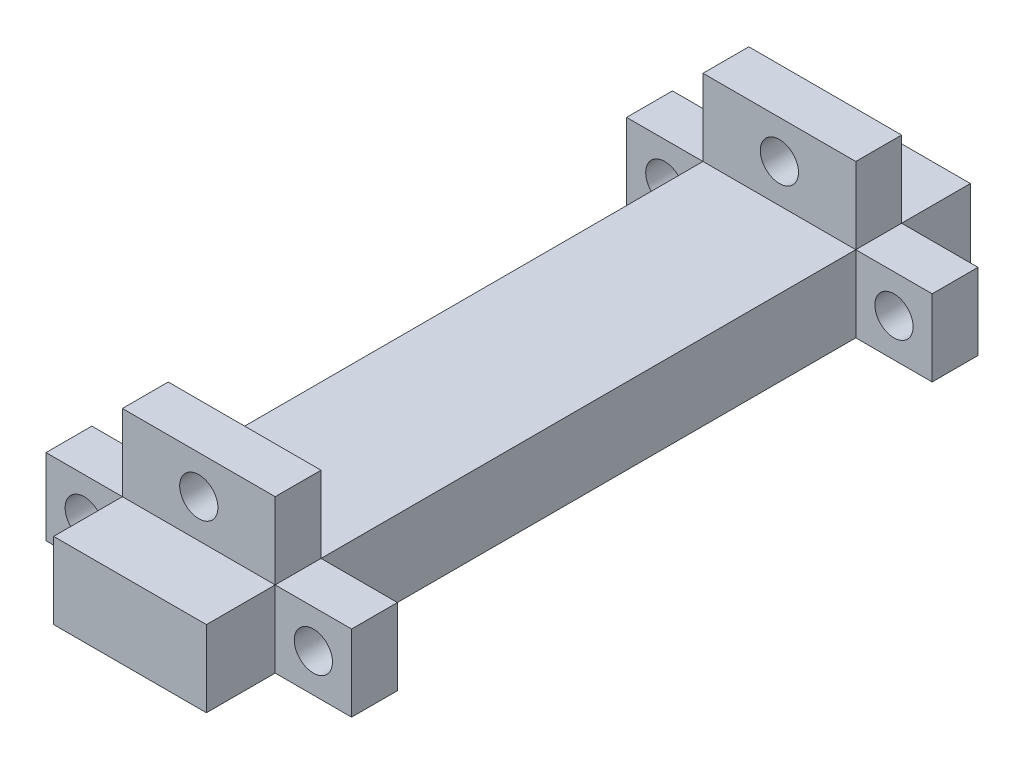
ISO-10303-21;
HEADER;
FILE_DESCRIPTION(('STEP AP214'),'2;1');
FILE_NAME('part.step','',(''),(''),'','','');
FILE_SCHEMA(('AUTOMOTIVE_DESIGN { 1 0 10303 214 1 1 1 1 }'));
ENDSEC;
DATA;
#1=APPLICATION_CONTEXT('core data for automotive mechanical design processes');
#2=APPLICATION_PROTOCOL_DEFINITION('international standard','automotive_design',2000,#1);
#3=PRODUCT_CONTEXT('',#1,'mechanical');
#4=PRODUCT('Part','Part','',(#3));
#5=PRODUCT_RELATED_PRODUCT_CATEGORY('part','',(#4));
#6=PRODUCT_DEFINITION_FORMATION('','',#4);
#7=PRODUCT_DEFINITION_CONTEXT('part definition',#1,'design');
#8=PRODUCT_DEFINITION('design','',#6,#7);
#9=PRODUCT_DEFINITION_SHAPE('','',#8);
#10=(LENGTH_UNIT() NAMED_UNIT(*) SI_UNIT(.MILLI.,.METRE.));
#11=(NAMED_UNIT(*) PLANE_ANGLE_UNIT() SI_UNIT($,.RADIAN.));
#12=(NAMED_UNIT(*) SI_UNIT($,.STERADIAN.) SOLID_ANGLE_UNIT());
#13=UNCERTAINTY_MEASURE_WITH_UNIT(LENGTH_MEASURE(1.E-05),#10,'distance_accuracy_value','');
#14=(GEOMETRIC_REPRESENTATION_CONTEXT(3) GLOBAL_UNCERTAINTY_ASSIGNED_CONTEXT((#13)) GLOBAL_UNIT_ASSIGNED_CONTEXT((#10,
#11,#12)) REPRESENTATION_CONTEXT('',''));
#15=CARTESIAN_POINT('',(0.,0.,0.));
#16=DIRECTION('',(0.,0.,1.));
#17=DIRECTION('',(1.,0.,0.));
#18=AXIS2_PLACEMENT_3D('',#15,#16,#17);
#19=CARTESIAN_POINT('',(0.,0.,100.));
#20=DIRECTION('',(-1.,0.,0.));
#21=DIRECTION('',(0.,-1.,0.));
#22=AXIS2_PLACEMENT_3D('',#19,#20,#21);
#23=PLANE('',#22);
#24=DIRECTION('',(0.,0.,-1.));
#25=VECTOR('',#24,1.);
#26=CARTESIAN_POINT('',(0.,0.,100.));
#27=LINE('',#26,#25);
#28=CARTESIAN_POINT('',(0.,0.,85.));
#29=VERTEX_POINT('',#28);
#30=CARTESIAN_POINT('',(0.,0.,15.));
#31=VERTEX_POINT('',#30);
#32=EDGE_CURVE('E54',#29,#31,#27,.T.);
#33=ORIENTED_EDGE('',*,*,#32,.F.);
#34=DIRECTION('',(0.,1.,0.));
#35=VECTOR('',#34,1.);
#36=CARTESIAN_POINT('',(0.,0.,85.));
#37=LINE('',#36,#35);
#38=CARTESIAN_POINT('',(0.,10.,85.));
#39=VERTEX_POINT('',#38);
#40=EDGE_CURVE('E211',#29,#39,#37,.T.);
#41=ORIENTED_EDGE('',*,*,#40,.T.);
#42=DIRECTION('',(0.,0.,-1.));
#43=VECTOR('',#42,1.);
#44=CARTESIAN_POINT('',(0.,10.,100.));
#45=LINE('',#44,#43);
#46=CARTESIAN_POINT('',(0.,10.,15.));
#47=VERTEX_POINT('',#46);
#48=EDGE_CURVE('E406',#39,#47,#45,.T.);
#49=ORIENTED_EDGE('',*,*,#48,.T.);
#50=DIRECTION('',(0.,1.,0.));
#51=VECTOR('',#50,1.);
#52=CARTESIAN_POINT('',(0.,0.,15.));
#53=LINE('',#52,#51);
#54=EDGE_CURVE('E328',#31,#47,#53,.T.);
#55=ORIENTED_EDGE('',*,*,#54,.F.);
#56=EDGE_LOOP('',(#33,#41,#49,#55));
#57=FACE_BOUND('',#56,.T.);
#58=ADVANCED_FACE('F36',(#57),#23,.T.);
#59=DIRECTION('',(0.,0.,1.));
#60=VECTOR('',#59,1.);
#61=CARTESIAN_POINT('',(0.,10.,85.));
#62=LINE('',#61,#60);
#63=CARTESIAN_POINT('',(0.,10.,91.));
#64=VERTEX_POINT('',#63);
#65=EDGE_CURVE('E234',#39,#64,#62,.T.);
#66=ORIENTED_EDGE('',*,*,#65,.T.);
#67=DIRECTION('',(0.,1.,0.));
#68=VECTOR('',#67,1.);
#69=CARTESIAN_POINT('',(0.,0.,91.));
#70=LINE('',#69,#68);
#71=CARTESIAN_POINT('',(0.,20.,91.));
#72=VERTEX_POINT('',#71);
#73=EDGE_CURVE('E240',#64,#72,#70,.T.);
#74=ORIENTED_EDGE('',*,*,#73,.T.);
#75=DIRECTION('',(0.,0.,1.));
#76=VECTOR('',#75,1.);
#77=CARTESIAN_POINT('',(0.,20.,85.));
#78=LINE('',#77,#76);
#79=CARTESIAN_POINT('',(0.,20.,85.));
#80=VERTEX_POINT('',#79);
#81=EDGE_CURVE('E245',#80,#72,#78,.T.);
#82=ORIENTED_EDGE('',*,*,#81,.F.);
#83=DIRECTION('',(0.,1.,0.));
#84=VECTOR('',#83,1.);
#85=CARTESIAN_POINT('',(0.,0.,85.));
#86=LINE('',#85,#84);
#87=EDGE_CURVE('E243',#39,#80,#86,.T.);
#88=ORIENTED_EDGE('',*,*,#87,.F.);
#89=EDGE_LOOP('',(#66,#74,#82,#88));
#90=FACE_BOUND('',#89,.T.);
#91=ADVANCED_FACE('F466',(#90),#23,.T.);
#92=CARTESIAN_POINT('',(0.,10.,100.));
#93=DIRECTION('',(0.,1.,0.));
#94=DIRECTION('',(0.,0.,1.));
#95=AXIS2_PLACEMENT_3D('',#92,#93,#94);
#96=PLANE('',#95);
#97=ORIENTED_EDGE('',*,*,#48,.F.);
#98=DIRECTION('',(1.,0.,0.));
#99=VECTOR('',#98,1.);
#100=CARTESIAN_POINT('',(0.,10.,85.));
#101=LINE('',#100,#99);
#102=CARTESIAN_POINT('',(20.,10.,85.));
#103=VERTEX_POINT('',#102);
#104=EDGE_CURVE('E226',#39,#103,#101,.T.);
#105=ORIENTED_EDGE('',*,*,#104,.T.);
#106=DIRECTION('',(0.,0.,-1.));
#107=VECTOR('',#106,1.);
#108=CARTESIAN_POINT('',(20.,10.,100.));
#109=LINE('',#108,#107);
#110=CARTESIAN_POINT('',(20.,10.,15.));
#111=VERTEX_POINT('',#110);
#112=EDGE_CURVE('E409',#103,#111,#109,.T.);
#113=ORIENTED_EDGE('',*,*,#112,.T.);
#114=DIRECTION('',(1.,0.,0.));
#115=VECTOR('',#114,1.);
#116=CARTESIAN_POINT('',(0.,10.,15.));
#117=LINE('',#116,#115);
#118=EDGE_CURVE('E351',#47,#111,#117,.T.);
#119=ORIENTED_EDGE('',*,*,#118,.F.);
#120=EDGE_LOOP('',(#97,#105,#113,#119));
#121=FACE_BOUND('',#120,.T.);
#122=ADVANCED_FACE('F530',(#121),#96,.T.);
#123=DIRECTION('',(0.,0.,1.));
#124=VECTOR('',#123,1.);
#125=CARTESIAN_POINT('',(20.,10.,85.));
#126=LINE('',#125,#124);
#127=CARTESIAN_POINT('',(20.,10.,91.));
#128=VERTEX_POINT('',#127);
#129=EDGE_CURVE('E237',#103,#128,#126,.T.);
#130=ORIENTED_EDGE('',*,*,#129,.T.);
#131=DIRECTION('',(1.,0.,0.));
#132=VECTOR('',#131,1.);
#133=CARTESIAN_POINT('',(0.,10.,91.));
#134=LINE('',#133,#132);
#135=CARTESIAN_POINT('',(30.,10.,91.));
#136=VERTEX_POINT('',#135);
#137=EDGE_CURVE('E282',#128,#136,#134,.T.);
#138=ORIENTED_EDGE('',*,*,#137,.T.);
#139=DIRECTION('',(0.,0.,1.));
#140=VECTOR('',#139,1.);
#141=CARTESIAN_POINT('',(30.,10.,85.));
#142=LINE('',#141,#140);
#143=CARTESIAN_POINT('',(30.,10.,85.));
#144=VERTEX_POINT('',#143);
#145=EDGE_CURVE('E279',#144,#136,#142,.T.);
#146=ORIENTED_EDGE('',*,*,#145,.F.);
#147=DIRECTION('',(1.,0.,0.));
#148=VECTOR('',#147,1.);
#149=CARTESIAN_POINT('',(0.,10.,85.));
#150=LINE('',#149,#148);
#151=EDGE_CURVE('E270',#103,#144,#150,.T.);
#152=ORIENTED_EDGE('',*,*,#151,.F.);
#153=EDGE_LOOP('',(#130,#138,#146,#152));
#154=FACE_BOUND('',#153,.T.);
#155=ADVANCED_FACE('F545',(#154),#96,.T.);
#156=CARTESIAN_POINT('',(20.,0.,100.));
#157=DIRECTION('',(-1.,0.,0.));
#158=DIRECTION('',(0.,-1.,0.));
#159=AXIS2_PLACEMENT_3D('',#156,#157,#158);
#160=PLANE('',#159);
#161=DIRECTION('',(0.,-1.,0.));
#162=VECTOR('',#161,1.);
#163=CARTESIAN_POINT('',(20.,0.,85.));
#164=LINE('',#163,#162);
#165=CARTESIAN_POINT('',(20.,0.,85.));
#166=VERTEX_POINT('',#165);
#167=EDGE_CURVE('E273',#103,#166,#164,.T.);
#168=ORIENTED_EDGE('',*,*,#167,.T.);
#169=DIRECTION('',(0.,0.,-1.));
#170=VECTOR('',#169,1.);
#171=CARTESIAN_POINT('',(20.,0.,100.));
#172=LINE('',#171,#170);
#173=CARTESIAN_POINT('',(20.,0.,15.));
#174=VERTEX_POINT('',#173);
#175=EDGE_CURVE('E45',#166,#174,#172,.T.);
#176=ORIENTED_EDGE('',*,*,#175,.T.);
#177=DIRECTION('',(0.,-1.,0.));
#178=VECTOR('',#177,1.);
#179=CARTESIAN_POINT('',(20.,0.,15.));
#180=LINE('',#179,#178);
#181=EDGE_CURVE('E300',#111,#174,#180,.T.);
#182=ORIENTED_EDGE('',*,*,#181,.F.);
#183=ORIENTED_EDGE('',*,*,#112,.F.);
#184=EDGE_LOOP('',(#168,#176,#182,#183));
#185=FACE_BOUND('',#184,.T.);
#186=ADVANCED_FACE('F555',(#185),#160,.F.);
#187=CARTESIAN_POINT('',(20.,0.,100.));
#188=VERTEX_POINT('',#187);
#189=CARTESIAN_POINT('',(20.,0.,91.));
#190=VERTEX_POINT('',#189);
#191=EDGE_CURVE('E11',#188,#190,#172,.T.);
#192=ORIENTED_EDGE('',*,*,#191,.T.);
#193=DIRECTION('',(0.,-1.,0.));
#194=VECTOR('',#193,1.);
#195=CARTESIAN_POINT('',(20.,0.,91.));
#196=LINE('',#195,#194);
#197=EDGE_CURVE('E285',#128,#190,#196,.T.);
#198=ORIENTED_EDGE('',*,*,#197,.F.);
#199=CARTESIAN_POINT('',(20.,10.,100.));
#200=VERTEX_POINT('',#199);
#201=EDGE_CURVE('E407',#200,#128,#109,.T.);
#202=ORIENTED_EDGE('',*,*,#201,.F.);
#203=DIRECTION('',(0.,1.,0.));
#204=VECTOR('',#203,1.);
#205=CARTESIAN_POINT('',(20.,0.,100.));
#206=LINE('',#205,#204);
#207=EDGE_CURVE('E380',#188,#200,#206,.T.);
#208=ORIENTED_EDGE('',*,*,#207,.F.);
#209=EDGE_LOOP('',(#192,#198,#202,#208));
#210=FACE_BOUND('',#209,.T.);
#211=ADVANCED_FACE('F550',(#210),#160,.F.);
#212=CARTESIAN_POINT('',(20.,10.,8.99999999999999));
#213=VERTEX_POINT('',#212);
#214=CARTESIAN_POINT('',(20.,10.,0.));
#215=VERTEX_POINT('',#214);
#216=EDGE_CURVE('E405',#213,#215,#109,.T.);
#217=ORIENTED_EDGE('',*,*,#216,.F.);
#218=DIRECTION('',(0.,-1.,0.));
#219=VECTOR('',#218,1.);
#220=CARTESIAN_POINT('',(20.,0.,9.));
#221=LINE('',#220,#219);
#222=CARTESIAN_POINT('',(20.,0.,9.));
#223=VERTEX_POINT('',#222);
#224=EDGE_CURVE('E297',#213,#223,#221,.T.);
#225=ORIENTED_EDGE('',*,*,#224,.T.);
#226=CARTESIAN_POINT('',(20.,0.,0.));
#227=VERTEX_POINT('',#226);
#228=EDGE_CURVE('E47',#223,#227,#172,.T.);
#229=ORIENTED_EDGE('',*,*,#228,.T.);
#230=DIRECTION('',(0.,1.,0.));
#231=VECTOR('',#230,1.);
#232=CARTESIAN_POINT('',(20.,0.,0.));
#233=LINE('',#232,#231);
#234=EDGE_CURVE('E392',#227,#215,#233,.T.);
#235=ORIENTED_EDGE('',*,*,#234,.T.);
#236=EDGE_LOOP('',(#217,#225,#229,#235));
#237=FACE_BOUND('',#236,.T.);
#238=ADVANCED_FACE('F546',(#237),#160,.F.);
#239=CARTESIAN_POINT('',(0.,0.,8.99999999999999));
#240=VERTEX_POINT('',#239);
#241=CARTESIAN_POINT('',(0.,0.,0.));
#242=VERTEX_POINT('',#241);
#243=EDGE_CURVE('E389',#240,#242,#27,.T.);
#244=ORIENTED_EDGE('',*,*,#243,.F.);
#245=DIRECTION('',(0.,1.,0.));
#246=VECTOR('',#245,1.);
#247=CARTESIAN_POINT('',(0.,0.,9.));
#248=LINE('',#247,#246);
#249=CARTESIAN_POINT('',(0.,10.,8.99999999999999));
#250=VERTEX_POINT('',#249);
#251=EDGE_CURVE('E329',#240,#250,#248,.T.);
#252=ORIENTED_EDGE('',*,*,#251,.T.);
#253=CARTESIAN_POINT('',(0.,10.,0.));
#254=VERTEX_POINT('',#253);
#255=EDGE_CURVE('E402',#250,#254,#45,.T.);
#256=ORIENTED_EDGE('',*,*,#255,.T.);
#257=DIRECTION('',(0.,1.,0.));
#258=VECTOR('',#257,1.);
#259=CARTESIAN_POINT('',(0.,0.,0.));
#260=LINE('',#259,#258);
#261=EDGE_CURVE('E381',#242,#254,#260,.T.);
#262=ORIENTED_EDGE('',*,*,#261,.F.);
#263=EDGE_LOOP('',(#244,#252,#256,#262));
#264=FACE_BOUND('',#263,.T.);
#265=ADVANCED_FACE('F489',(#264),#23,.T.);
#266=DIRECTION('',(0.,0.,-1.));
#267=VECTOR('',#266,1.);
#268=CARTESIAN_POINT('',(0.,10.,15.));
#269=LINE('',#268,#267);
#270=EDGE_CURVE('E322',#47,#250,#269,.T.);
#271=ORIENTED_EDGE('',*,*,#270,.F.);
#272=DIRECTION('',(0.,1.,0.));
#273=VECTOR('',#272,1.);
#274=CARTESIAN_POINT('',(0.,0.,15.));
#275=LINE('',#274,#273);
#276=CARTESIAN_POINT('',(0.,20.,15.));
#277=VERTEX_POINT('',#276);
#278=EDGE_CURVE('E354',#47,#277,#275,.T.);
#279=ORIENTED_EDGE('',*,*,#278,.T.);
#280=DIRECTION('',(0.,0.,-1.));
#281=VECTOR('',#280,1.);
#282=CARTESIAN_POINT('',(0.,20.,15.));
#283=LINE('',#282,#281);
#284=CARTESIAN_POINT('',(0.,20.,9.));
#285=VERTEX_POINT('',#284);
#286=EDGE_CURVE('E362',#277,#285,#283,.T.);
#287=ORIENTED_EDGE('',*,*,#286,.T.);
#288=DIRECTION('',(0.,1.,0.));
#289=VECTOR('',#288,1.);
#290=CARTESIAN_POINT('',(0.,0.,9.));
#291=LINE('',#290,#289);
#292=EDGE_CURVE('E365',#250,#285,#291,.T.);
#293=ORIENTED_EDGE('',*,*,#292,.F.);
#294=EDGE_LOOP('',(#271,#279,#287,#293));
#295=FACE_BOUND('',#294,.T.);
#296=ADVANCED_FACE('F499',(#295),#23,.T.);
#297=ORIENTED_EDGE('',*,*,#255,.F.);
#298=DIRECTION('',(1.,0.,0.));
#299=VECTOR('',#298,1.);
#300=CARTESIAN_POINT('',(0.,10.,9.));
#301=LINE('',#300,#299);
#302=EDGE_CURVE('E345',#250,#213,#301,.T.);
#303=ORIENTED_EDGE('',*,*,#302,.T.);
#304=ORIENTED_EDGE('',*,*,#216,.T.);
#305=DIRECTION('',(1.,0.,0.));
#306=VECTOR('',#305,1.);
#307=CARTESIAN_POINT('',(0.,10.,0.));
#308=LINE('',#307,#306);
#309=EDGE_CURVE('E395',#254,#215,#308,.T.);
#310=ORIENTED_EDGE('',*,*,#309,.F.);
#311=EDGE_LOOP('',(#297,#303,#304,#310));
#312=FACE_BOUND('',#311,.T.);
#313=ADVANCED_FACE('F494',(#312),#96,.T.);
#314=CARTESIAN_POINT('',(0.,0.,100.));
#315=DIRECTION('',(0.,1.,0.));
#316=DIRECTION('',(0.,0.,1.));
#317=AXIS2_PLACEMENT_3D('',#314,#315,#316);
#318=PLANE('',#317);
#319=DIRECTION('',(1.,0.,0.));
#320=VECTOR('',#319,1.);
#321=CARTESIAN_POINT('',(0.,0.,0.));
#322=LINE('',#321,#320);
#323=EDGE_CURVE('E375',#242,#227,#322,.T.);
#324=ORIENTED_EDGE('',*,*,#323,.T.);
#325=ORIENTED_EDGE('',*,*,#228,.F.);
#326=DIRECTION('',(1.,0.,0.));
#327=VECTOR('',#326,1.);
#328=CARTESIAN_POINT('',(0.,0.,9.));
#329=LINE('',#328,#327);
#330=CARTESIAN_POINT('',(30.,0.,9.));
#331=VERTEX_POINT('',#330);
#332=EDGE_CURVE('E296',#223,#331,#329,.T.);
#333=ORIENTED_EDGE('',*,*,#332,.T.);
#334=DIRECTION('',(0.,0.,-1.));
#335=VECTOR('',#334,1.);
#336=CARTESIAN_POINT('',(30.,0.,15.));
#337=LINE('',#336,#335);
#338=CARTESIAN_POINT('',(30.,0.,15.));
#339=VERTEX_POINT('',#338);
#340=EDGE_CURVE('E310',#339,#331,#337,.T.);
#341=ORIENTED_EDGE('',*,*,#340,.F.);
#342=DIRECTION('',(1.,0.,0.));
#343=VECTOR('',#342,1.);
#344=CARTESIAN_POINT('',(0.,0.,15.));
#345=LINE('',#344,#343);
#346=EDGE_CURVE('E301',#174,#339,#345,.T.);
#347=ORIENTED_EDGE('',*,*,#346,.F.);
#348=ORIENTED_EDGE('',*,*,#175,.F.);
#349=DIRECTION('',(1.,0.,0.));
#350=VECTOR('',#349,1.);
#351=CARTESIAN_POINT('',(0.,0.,85.));
#352=LINE('',#351,#350);
#353=CARTESIAN_POINT('',(30.,0.,85.));
#354=VERTEX_POINT('',#353);
#355=EDGE_CURVE('E276',#166,#354,#352,.T.);
#356=ORIENTED_EDGE('',*,*,#355,.T.);
#357=DIRECTION('',(0.,0.,1.));
#358=VECTOR('',#357,1.);
#359=CARTESIAN_POINT('',(30.,0.,85.));
#360=LINE('',#359,#358);
#361=CARTESIAN_POINT('',(30.,0.,91.));
#362=VERTEX_POINT('',#361);
#363=EDGE_CURVE('E289',#354,#362,#360,.T.);
#364=ORIENTED_EDGE('',*,*,#363,.T.);
#365=DIRECTION('',(1.,0.,0.));
#366=VECTOR('',#365,1.);
#367=CARTESIAN_POINT('',(0.,0.,91.));
#368=LINE('',#367,#366);
#369=EDGE_CURVE('E271',#190,#362,#368,.T.);
#370=ORIENTED_EDGE('',*,*,#369,.F.);
#371=ORIENTED_EDGE('',*,*,#191,.F.);
#372=DIRECTION('',(1.,0.,0.));
#373=VECTOR('',#372,1.);
#374=CARTESIAN_POINT('',(0.,0.,100.));
#375=LINE('',#374,#373);
#376=CARTESIAN_POINT('',(0.,0.,100.));
#377=VERTEX_POINT('',#376);
#378=EDGE_CURVE('E377',#377,#188,#375,.T.);
#379=ORIENTED_EDGE('',*,*,#378,.F.);
#380=CARTESIAN_POINT('',(0.,0.,91.));
#381=VERTEX_POINT('',#380);
#382=EDGE_CURVE('E400',#377,#381,#27,.T.);
#383=ORIENTED_EDGE('',*,*,#382,.T.);
#384=DIRECTION('',(-1.,0.,0.));
#385=VECTOR('',#384,1.);
#386=CARTESIAN_POINT('',(0.,0.,91.));
#387=LINE('',#386,#385);
#388=CARTESIAN_POINT('',(-10.,0.,91.));
#389=VERTEX_POINT('',#388);
#390=EDGE_CURVE('E221',#381,#389,#387,.T.);
#391=ORIENTED_EDGE('',*,*,#390,.T.);
#392=DIRECTION('',(0.,0.,1.));
#393=VECTOR('',#392,1.);
#394=CARTESIAN_POINT('',(-10.,0.,85.));
#395=LINE('',#394,#393);
#396=CARTESIAN_POINT('',(-10.,0.,85.));
#397=VERTEX_POINT('',#396);
#398=EDGE_CURVE('E218',#397,#389,#395,.T.);
#399=ORIENTED_EDGE('',*,*,#398,.F.);
#400=DIRECTION('',(-1.,0.,0.));
#401=VECTOR('',#400,1.);
#402=CARTESIAN_POINT('',(0.,0.,85.));
#403=LINE('',#402,#401);
#404=EDGE_CURVE('E228',#29,#397,#403,.T.);
#405=ORIENTED_EDGE('',*,*,#404,.F.);
#406=ORIENTED_EDGE('',*,*,#32,.T.);
#407=DIRECTION('',(-1.,0.,0.));
#408=VECTOR('',#407,1.);
#409=CARTESIAN_POINT('',(0.,0.,15.));
#410=LINE('',#409,#408);
#411=CARTESIAN_POINT('',(-10.,0.,15.));
#412=VERTEX_POINT('',#411);
#413=EDGE_CURVE('E333',#31,#412,#410,.T.);
#414=ORIENTED_EDGE('',*,*,#413,.T.);
#415=DIRECTION('',(0.,0.,-1.));
#416=VECTOR('',#415,1.);
#417=CARTESIAN_POINT('',(-10.,0.,15.));
#418=LINE('',#417,#416);
#419=CARTESIAN_POINT('',(-10.,0.,9.));
#420=VERTEX_POINT('',#419);
#421=EDGE_CURVE('E336',#412,#420,#418,.T.);
#422=ORIENTED_EDGE('',*,*,#421,.T.);
#423=DIRECTION('',(-1.,0.,0.));
#424=VECTOR('',#423,1.);
#425=CARTESIAN_POINT('',(0.,0.,9.));
#426=LINE('',#425,#424);
#427=EDGE_CURVE('E339',#240,#420,#426,.T.);
#428=ORIENTED_EDGE('',*,*,#427,.F.);
#429=ORIENTED_EDGE('',*,*,#243,.T.);
#430=EDGE_LOOP('',(#324,#325,#333,#341,#347,#348,#356,#364,#370,#371,#379,#383,#391,#399,#405,
#406,#414,#422,#428,#429));
#431=FACE_BOUND('',#430,.T.);
#432=ADVANCED_FACE('F38',(#431),#318,.F.);
#433=DIRECTION('',(0.,1.,0.));
#434=VECTOR('',#433,1.);
#435=CARTESIAN_POINT('',(20.,0.,15.));
#436=LINE('',#435,#434);
#437=CARTESIAN_POINT('',(20.,20.,15.));
#438=VERTEX_POINT('',#437);
#439=EDGE_CURVE('E360',#111,#438,#436,.T.);
#440=ORIENTED_EDGE('',*,*,#439,.F.);
#441=DIRECTION('',(0.,0.,-1.));
#442=VECTOR('',#441,1.);
#443=CARTESIAN_POINT('',(20.,10.,15.));
#444=LINE('',#443,#442);
#445=EDGE_CURVE('E293',#111,#213,#444,.T.);
#446=ORIENTED_EDGE('',*,*,#445,.T.);
#447=DIRECTION('',(0.,1.,0.));
#448=VECTOR('',#447,1.);
#449=CARTESIAN_POINT('',(20.,0.,9.));
#450=LINE('',#449,#448);
#451=CARTESIAN_POINT('',(20.,20.,9.));
#452=VERTEX_POINT('',#451);
#453=EDGE_CURVE('E355',#213,#452,#450,.T.);
#454=ORIENTED_EDGE('',*,*,#453,.T.);
#455=DIRECTION('',(0.,0.,-1.));
#456=VECTOR('',#455,1.);
#457=CARTESIAN_POINT('',(20.,20.,15.));
#458=LINE('',#457,#456);
#459=EDGE_CURVE('E372',#438,#452,#458,.T.);
#460=ORIENTED_EDGE('',*,*,#459,.F.);
#461=EDGE_LOOP('',(#440,#446,#454,#460));
#462=FACE_BOUND('',#461,.T.);
#463=ADVANCED_FACE('F539',(#462),#160,.F.);
#464=DIRECTION('',(1.,0.,0.));
#465=VECTOR('',#464,1.);
#466=CARTESIAN_POINT('',(0.,10.,91.));
#467=LINE('',#466,#465);
#468=EDGE_CURVE('E257',#64,#128,#467,.T.);
#469=ORIENTED_EDGE('',*,*,#468,.F.);
#470=CARTESIAN_POINT('',(0.,10.,100.));
#471=VERTEX_POINT('',#470);
#472=EDGE_CURVE('E403',#471,#64,#45,.T.);
#473=ORIENTED_EDGE('',*,*,#472,.F.);
#474=DIRECTION('',(1.,0.,0.));
#475=VECTOR('',#474,1.);
#476=CARTESIAN_POINT('',(0.,10.,100.));
#477=LINE('',#476,#475);
#478=EDGE_CURVE('E383',#471,#200,#477,.T.);
#479=ORIENTED_EDGE('',*,*,#478,.T.);
#480=ORIENTED_EDGE('',*,*,#201,.T.);
#481=EDGE_LOOP('',(#469,#473,#479,#480));
#482=FACE_BOUND('',#481,.T.);
#483=ADVANCED_FACE('F458',(#482),#96,.T.);
#484=DIRECTION('',(0.,1.,0.));
#485=VECTOR('',#484,1.);
#486=CARTESIAN_POINT('',(0.,0.,91.));
#487=LINE('',#486,#485);
#488=EDGE_CURVE('E62',#381,#64,#487,.T.);
#489=ORIENTED_EDGE('',*,*,#488,.F.);
#490=ORIENTED_EDGE('',*,*,#382,.F.);
#491=DIRECTION('',(0.,1.,0.));
#492=VECTOR('',#491,1.);
#493=CARTESIAN_POINT('',(0.,0.,100.));
#494=LINE('',#493,#492);
#495=EDGE_CURVE('E386',#377,#471,#494,.T.);
#496=ORIENTED_EDGE('',*,*,#495,.T.);
#497=ORIENTED_EDGE('',*,*,#472,.T.);
#498=EDGE_LOOP('',(#489,#490,#496,#497));
#499=FACE_BOUND('',#498,.T.);
#500=ADVANCED_FACE('F451',(#499),#23,.T.);
#501=CARTESIAN_POINT('',(0.,0.,100.));
#502=DIRECTION('',(0.,0.,1.));
#503=DIRECTION('',(1.,0.,0.));
#504=AXIS2_PLACEMENT_3D('',#501,#502,#503);
#505=PLANE('',#504);
#506=ORIENTED_EDGE('',*,*,#378,.T.);
#507=ORIENTED_EDGE('',*,*,#207,.T.);
#508=ORIENTED_EDGE('',*,*,#478,.F.);
#509=ORIENTED_EDGE('',*,*,#495,.F.);
#510=EDGE_LOOP('',(#506,#507,#508,#509));
#511=FACE_BOUND('',#510,.T.);
#512=ADVANCED_FACE('F455',(#511),#505,.T.);
#513=CARTESIAN_POINT('',(0.,0.,0.));
#514=DIRECTION('',(0.,0.,1.));
#515=DIRECTION('',(1.,0.,0.));
#516=AXIS2_PLACEMENT_3D('',#513,#514,#515);
#517=PLANE('',#516);
#518=ORIENTED_EDGE('',*,*,#323,.F.);
#519=ORIENTED_EDGE('',*,*,#261,.T.);
#520=ORIENTED_EDGE('',*,*,#309,.T.);
#521=ORIENTED_EDGE('',*,*,#234,.F.);
#522=EDGE_LOOP('',(#518,#519,#520,#521));
#523=FACE_BOUND('',#522,.T.);
#524=ADVANCED_FACE('F519',(#523),#517,.F.);
#525=CARTESIAN_POINT('',(0.,20.,15.));
#526=DIRECTION('',(0.,-1.,0.));
#527=DIRECTION('',(0.,0.,-1.));
#528=AXIS2_PLACEMENT_3D('',#525,#526,#527);
#529=PLANE('',#528);
#530=DIRECTION('',(-1.,0.,0.));
#531=VECTOR('',#530,1.);
#532=CARTESIAN_POINT('',(0.,20.,9.));
#533=LINE('',#532,#531);
#534=EDGE_CURVE('E368',#452,#285,#533,.T.);
#535=ORIENTED_EDGE('',*,*,#534,.T.);
#536=ORIENTED_EDGE('',*,*,#286,.F.);
#537=DIRECTION('',(-1.,0.,0.));
#538=VECTOR('',#537,1.);
#539=CARTESIAN_POINT('',(0.,20.,15.));
#540=LINE('',#539,#538);
#541=EDGE_CURVE('E358',#438,#277,#540,.T.);
#542=ORIENTED_EDGE('',*,*,#541,.F.);
#543=ORIENTED_EDGE('',*,*,#459,.T.);
#544=EDGE_LOOP('',(#535,#536,#542,#543));
#545=FACE_BOUND('',#544,.T.);
#546=ADVANCED_FACE('F581',(#545),#529,.F.);
#547=CARTESIAN_POINT('',(0.,0.,15.));
#548=DIRECTION('',(0.,0.,-1.));
#549=DIRECTION('',(-1.,0.,0.));
#550=AXIS2_PLACEMENT_3D('',#547,#548,#549);
#551=PLANE('',#550);
#552=CARTESIAN_POINT('',(10.,15.,15.));
#553=DIRECTION('',(0.,0.,-1.));
#554=DIRECTION('',(-1.,0.,0.));
#555=AXIS2_PLACEMENT_3D('',#552,#553,#554);
#556=CIRCLE('',#555,2.5);
#557=CARTESIAN_POINT('',(7.5,15.,15.));
#558=VERTEX_POINT('',#557);
#559=EDGE_CURVE('E434',#558,#558,#556,.T.);
#560=ORIENTED_EDGE('',*,*,#559,.T.);
#561=EDGE_LOOP('',(#560));
#562=FACE_BOUND('',#561,.T.);
#563=ORIENTED_EDGE('',*,*,#118,.T.);
#564=ORIENTED_EDGE('',*,*,#439,.T.);
#565=ORIENTED_EDGE('',*,*,#541,.T.);
#566=ORIENTED_EDGE('',*,*,#278,.F.);
#567=EDGE_LOOP('',(#563,#564,#565,#566));
#568=FACE_BOUND('',#567,.T.);
#569=ADVANCED_FACE('F516',(#562,#568),#551,.F.);
#570=CARTESIAN_POINT('',(0.,0.,9.));
#571=DIRECTION('',(0.,0.,-1.));
#572=DIRECTION('',(-1.,0.,0.));
#573=AXIS2_PLACEMENT_3D('',#570,#571,#572);
#574=PLANE('',#573);
#575=CARTESIAN_POINT('',(10.,15.,8.99999999999999));
#576=DIRECTION('',(0.,0.,-1.));
#577=DIRECTION('',(-1.,0.,0.));
#578=AXIS2_PLACEMENT_3D('',#575,#576,#577);
#579=CIRCLE('',#578,2.5);
#580=CARTESIAN_POINT('',(7.5,15.,8.99999999999999));
#581=VERTEX_POINT('',#580);
#582=EDGE_CURVE('E421',#581,#581,#579,.T.);
#583=ORIENTED_EDGE('',*,*,#582,.F.);
#584=EDGE_LOOP('',(#583));
#585=FACE_BOUND('',#584,.T.);
#586=ORIENTED_EDGE('',*,*,#302,.F.);
#587=ORIENTED_EDGE('',*,*,#292,.T.);
#588=ORIENTED_EDGE('',*,*,#534,.F.);
#589=ORIENTED_EDGE('',*,*,#453,.F.);
#590=EDGE_LOOP('',(#586,#587,#588,#589));
#591=FACE_BOUND('',#590,.T.);
#592=ADVANCED_FACE('F504',(#585,#591),#574,.T.);
#593=CARTESIAN_POINT('',(0.,10.,15.));
#594=DIRECTION('',(0.,-1.,0.));
#595=DIRECTION('',(0.,0.,-1.));
#596=AXIS2_PLACEMENT_3D('',#593,#594,#595);
#597=PLANE('',#596);
#598=DIRECTION('',(-1.,0.,0.));
#599=VECTOR('',#598,1.);
#600=CARTESIAN_POINT('',(0.,10.,9.));
#601=LINE('',#600,#599);
#602=CARTESIAN_POINT('',(-10.,10.,9.));
#603=VERTEX_POINT('',#602);
#604=EDGE_CURVE('E318',#250,#603,#601,.T.);
#605=ORIENTED_EDGE('',*,*,#604,.T.);
#606=DIRECTION('',(0.,0.,-1.));
#607=VECTOR('',#606,1.);
#608=CARTESIAN_POINT('',(-10.,10.,15.));
#609=LINE('',#608,#607);
#610=CARTESIAN_POINT('',(-10.,10.,15.));
#611=VERTEX_POINT('',#610);
#612=EDGE_CURVE('E332',#611,#603,#609,.T.);
#613=ORIENTED_EDGE('',*,*,#612,.F.);
#614=DIRECTION('',(-1.,0.,0.));
#615=VECTOR('',#614,1.);
#616=CARTESIAN_POINT('',(0.,10.,15.));
#617=LINE('',#616,#615);
#618=EDGE_CURVE('E326',#47,#611,#617,.T.);
#619=ORIENTED_EDGE('',*,*,#618,.F.);
#620=ORIENTED_EDGE('',*,*,#270,.T.);
#621=EDGE_LOOP('',(#605,#613,#619,#620));
#622=FACE_BOUND('',#621,.T.);
#623=ADVANCED_FACE('F506',(#622),#597,.F.);
#624=CARTESIAN_POINT('',(-10.,0.,15.));
#625=DIRECTION('',(-1.,0.,0.));
#626=DIRECTION('',(0.,0.,1.));
#627=AXIS2_PLACEMENT_3D('',#624,#625,#626);
#628=PLANE('',#627);
#629=DIRECTION('',(0.,1.,0.));
#630=VECTOR('',#629,1.);
#631=CARTESIAN_POINT('',(-10.,0.,9.));
#632=LINE('',#631,#630);
#633=EDGE_CURVE('E342',#420,#603,#632,.T.);
#634=ORIENTED_EDGE('',*,*,#633,.F.);
#635=ORIENTED_EDGE('',*,*,#421,.F.);
#636=DIRECTION('',(0.,1.,0.));
#637=VECTOR('',#636,1.);
#638=CARTESIAN_POINT('',(-10.,0.,15.));
#639=LINE('',#638,#637);
#640=EDGE_CURVE('E325',#412,#611,#639,.T.);
#641=ORIENTED_EDGE('',*,*,#640,.T.);
#642=ORIENTED_EDGE('',*,*,#612,.T.);
#643=EDGE_LOOP('',(#634,#635,#641,#642));
#644=FACE_BOUND('',#643,.T.);
#645=ADVANCED_FACE('F480',(#644),#628,.T.);
#646=CARTESIAN_POINT('',(0.,0.,15.));
#647=DIRECTION('',(0.,0.,-1.));
#648=DIRECTION('',(-1.,0.,0.));
#649=AXIS2_PLACEMENT_3D('',#646,#647,#648);
#650=PLANE('',#649);
#651=CARTESIAN_POINT('',(-5.,5.,15.));
#652=DIRECTION('',(0.,0.,-1.));
#653=DIRECTION('',(-1.,0.,0.));
#654=AXIS2_PLACEMENT_3D('',#651,#652,#653);
#655=CIRCLE('',#654,2.5);
#656=CARTESIAN_POINT('',(-7.5,5.,15.));
#657=VERTEX_POINT('',#656);
#658=EDGE_CURVE('E417',#657,#657,#655,.T.);
#659=ORIENTED_EDGE('',*,*,#658,.T.);
#660=EDGE_LOOP('',(#659));
#661=FACE_BOUND('',#660,.T.);
#662=ORIENTED_EDGE('',*,*,#618,.T.);
#663=ORIENTED_EDGE('',*,*,#640,.F.);
#664=ORIENTED_EDGE('',*,*,#413,.F.);
#665=ORIENTED_EDGE('',*,*,#54,.T.);
#666=EDGE_LOOP('',(#662,#663,#664,#665));
#667=FACE_BOUND('',#666,.T.);
#668=ADVANCED_FACE('F475',(#661,#667),#650,.F.);
#669=CARTESIAN_POINT('',(0.,0.,9.));
#670=DIRECTION('',(0.,0.,-1.));
#671=DIRECTION('',(-1.,0.,0.));
#672=AXIS2_PLACEMENT_3D('',#669,#670,#671);
#673=PLANE('',#672);
#674=CARTESIAN_POINT('',(-5.,5.,8.99999999999999));
#675=DIRECTION('',(0.,0.,-1.));
#676=DIRECTION('',(-1.,0.,0.));
#677=AXIS2_PLACEMENT_3D('',#674,#675,#676);
#678=CIRCLE('',#677,2.5);
#679=CARTESIAN_POINT('',(-7.5,5.,8.99999999999999));
#680=VERTEX_POINT('',#679);
#681=EDGE_CURVE('E424',#680,#680,#678,.T.);
#682=ORIENTED_EDGE('',*,*,#681,.F.);
#683=EDGE_LOOP('',(#682));
#684=FACE_BOUND('',#683,.T.);
#685=ORIENTED_EDGE('',*,*,#604,.F.);
#686=ORIENTED_EDGE('',*,*,#251,.F.);
#687=ORIENTED_EDGE('',*,*,#427,.T.);
#688=ORIENTED_EDGE('',*,*,#633,.T.);
#689=EDGE_LOOP('',(#685,#686,#687,#688));
#690=FACE_BOUND('',#689,.T.);
#691=ADVANCED_FACE('F486',(#684,#690),#673,.T.);
#692=CARTESIAN_POINT('',(30.,0.,15.));
#693=DIRECTION('',(-1.,0.,0.));
#694=DIRECTION('',(0.,0.,1.));
#695=AXIS2_PLACEMENT_3D('',#692,#693,#694);
#696=PLANE('',#695);
#697=DIRECTION('',(0.,1.,0.));
#698=VECTOR('',#697,1.);
#699=CARTESIAN_POINT('',(30.,0.,9.));
#700=LINE('',#699,#698);
#701=CARTESIAN_POINT('',(30.,10.,9.));
#702=VERTEX_POINT('',#701);
#703=EDGE_CURVE('E291',#331,#702,#700,.T.);
#704=ORIENTED_EDGE('',*,*,#703,.T.);
#705=DIRECTION('',(0.,0.,-1.));
#706=VECTOR('',#705,1.);
#707=CARTESIAN_POINT('',(30.,10.,15.));
#708=LINE('',#707,#706);
#709=CARTESIAN_POINT('',(30.,10.,15.));
#710=VERTEX_POINT('',#709);
#711=EDGE_CURVE('E309',#710,#702,#708,.T.);
#712=ORIENTED_EDGE('',*,*,#711,.F.);
#713=DIRECTION('',(0.,1.,0.));
#714=VECTOR('',#713,1.);
#715=CARTESIAN_POINT('',(30.,0.,15.));
#716=LINE('',#715,#714);
#717=EDGE_CURVE('E298',#339,#710,#716,.T.);
#718=ORIENTED_EDGE('',*,*,#717,.F.);
#719=ORIENTED_EDGE('',*,*,#340,.T.);
#720=EDGE_LOOP('',(#704,#712,#718,#719));
#721=FACE_BOUND('',#720,.T.);
#722=ADVANCED_FACE('F509',(#721),#696,.F.);
#723=CARTESIAN_POINT('',(0.,10.,15.));
#724=DIRECTION('',(0.,1.,0.));
#725=DIRECTION('',(-1.,0.,0.));
#726=AXIS2_PLACEMENT_3D('',#723,#724,#725);
#727=PLANE('',#726);
#728=DIRECTION('',(1.,0.,0.));
#729=VECTOR('',#728,1.);
#730=CARTESIAN_POINT('',(0.,10.,9.));
#731=LINE('',#730,#729);
#732=EDGE_CURVE('E303',#213,#702,#731,.T.);
#733=ORIENTED_EDGE('',*,*,#732,.F.);
#734=ORIENTED_EDGE('',*,*,#445,.F.);
#735=DIRECTION('',(1.,0.,0.));
#736=VECTOR('',#735,1.);
#737=CARTESIAN_POINT('',(0.,10.,15.));
#738=LINE('',#737,#736);
#739=EDGE_CURVE('E306',#111,#710,#738,.T.);
#740=ORIENTED_EDGE('',*,*,#739,.T.);
#741=ORIENTED_EDGE('',*,*,#711,.T.);
#742=EDGE_LOOP('',(#733,#734,#740,#741));
#743=FACE_BOUND('',#742,.T.);
#744=ADVANCED_FACE('F522',(#743),#727,.T.);
#745=CARTESIAN_POINT('',(0.,0.,15.));
#746=DIRECTION('',(0.,0.,-1.));
#747=DIRECTION('',(-1.,0.,0.));
#748=AXIS2_PLACEMENT_3D('',#745,#746,#747);
#749=PLANE('',#748);
#750=CARTESIAN_POINT('',(25.,5.,15.));
#751=DIRECTION('',(0.,0.,-1.));
#752=DIRECTION('',(-1.,0.,0.));
#753=AXIS2_PLACEMENT_3D('',#750,#751,#752);
#754=CIRCLE('',#753,2.5);
#755=CARTESIAN_POINT('',(22.5,5.,15.));
#756=VERTEX_POINT('',#755);
#757=EDGE_CURVE('E236',#756,#756,#754,.T.);
#758=ORIENTED_EDGE('',*,*,#757,.T.);
#759=EDGE_LOOP('',(#758));
#760=FACE_BOUND('',#759,.T.);
#761=ORIENTED_EDGE('',*,*,#717,.T.);
#762=ORIENTED_EDGE('',*,*,#739,.F.);
#763=ORIENTED_EDGE('',*,*,#181,.T.);
#764=ORIENTED_EDGE('',*,*,#346,.T.);
#765=EDGE_LOOP('',(#761,#762,#763,#764));
#766=FACE_BOUND('',#765,.T.);
#767=ADVANCED_FACE('F603',(#760,#766),#749,.F.);
#768=CARTESIAN_POINT('',(0.,0.,9.));
#769=DIRECTION('',(0.,0.,-1.));
#770=DIRECTION('',(-1.,0.,0.));
#771=AXIS2_PLACEMENT_3D('',#768,#769,#770);
#772=PLANE('',#771);
#773=CARTESIAN_POINT('',(25.,5.,8.99999999999999));
#774=DIRECTION('',(0.,0.,-1.));
#775=DIRECTION('',(-1.,0.,0.));
#776=AXIS2_PLACEMENT_3D('',#773,#774,#775);
#777=CIRCLE('',#776,2.5);
#778=CARTESIAN_POINT('',(22.5,5.,8.99999999999999));
#779=VERTEX_POINT('',#778);
#780=EDGE_CURVE('E440',#779,#779,#777,.T.);
#781=ORIENTED_EDGE('',*,*,#780,.F.);
#782=EDGE_LOOP('',(#781));
#783=FACE_BOUND('',#782,.T.);
#784=ORIENTED_EDGE('',*,*,#703,.F.);
#785=ORIENTED_EDGE('',*,*,#332,.F.);
#786=ORIENTED_EDGE('',*,*,#224,.F.);
#787=ORIENTED_EDGE('',*,*,#732,.T.);
#788=EDGE_LOOP('',(#784,#785,#786,#787));
#789=FACE_BOUND('',#788,.T.);
#790=ADVANCED_FACE('F608',(#783,#789),#772,.T.);
#791=CARTESIAN_POINT('',(30.,0.,85.));
#792=DIRECTION('',(1.,0.,0.));
#793=DIRECTION('',(0.,0.,-1.));
#794=AXIS2_PLACEMENT_3D('',#791,#792,#793);
#795=PLANE('',#794);
#796=DIRECTION('',(0.,1.,0.));
#797=VECTOR('',#796,1.);
#798=CARTESIAN_POINT('',(30.,0.,91.));
#799=LINE('',#798,#797);
#800=EDGE_CURVE('E253',#362,#136,#799,.T.);
#801=ORIENTED_EDGE('',*,*,#800,.F.);
#802=ORIENTED_EDGE('',*,*,#363,.F.);
#803=DIRECTION('',(0.,1.,0.));
#804=VECTOR('',#803,1.);
#805=CARTESIAN_POINT('',(30.,0.,85.));
#806=LINE('',#805,#804);
#807=EDGE_CURVE('E267',#354,#144,#806,.T.);
#808=ORIENTED_EDGE('',*,*,#807,.T.);
#809=ORIENTED_EDGE('',*,*,#145,.T.);
#810=EDGE_LOOP('',(#801,#802,#808,#809));
#811=FACE_BOUND('',#810,.T.);
#812=ADVANCED_FACE('F610',(#811),#795,.T.);
#813=CARTESIAN_POINT('',(0.,0.,85.));
#814=DIRECTION('',(0.,0.,1.));
#815=DIRECTION('',(-1.,0.,0.));
#816=AXIS2_PLACEMENT_3D('',#813,#814,#815);
#817=PLANE('',#816);
#818=CARTESIAN_POINT('',(25.,5.,85.));
#819=DIRECTION('',(0.,0.,1.));
#820=DIRECTION('',(1.,0.,0.));
#821=AXIS2_PLACEMENT_3D('',#818,#819,#820);
#822=CIRCLE('',#821,2.5);
#823=CARTESIAN_POINT('',(27.5,5.,85.));
#824=VERTEX_POINT('',#823);
#825=EDGE_CURVE('E437',#824,#824,#822,.T.);
#826=ORIENTED_EDGE('',*,*,#825,.T.);
#827=EDGE_LOOP('',(#826));
#828=FACE_BOUND('',#827,.T.);
#829=ORIENTED_EDGE('',*,*,#807,.F.);
#830=ORIENTED_EDGE('',*,*,#355,.F.);
#831=ORIENTED_EDGE('',*,*,#167,.F.);
#832=ORIENTED_EDGE('',*,*,#151,.T.);
#833=EDGE_LOOP('',(#829,#830,#831,#832));
#834=FACE_BOUND('',#833,.T.);
#835=ADVANCED_FACE('F618',(#828,#834),#817,.F.);
#836=CARTESIAN_POINT('',(0.,0.,91.));
#837=DIRECTION('',(0.,0.,1.));
#838=DIRECTION('',(-1.,0.,0.));
#839=AXIS2_PLACEMENT_3D('',#836,#837,#838);
#840=PLANE('',#839);
#841=CARTESIAN_POINT('',(25.,5.,91.));
#842=DIRECTION('',(0.,0.,1.));
#843=DIRECTION('',(1.,0.,0.));
#844=AXIS2_PLACEMENT_3D('',#841,#842,#843);
#845=CIRCLE('',#844,2.5);
#846=CARTESIAN_POINT('',(27.5,5.,91.));
#847=VERTEX_POINT('',#846);
#848=EDGE_CURVE('E40',#847,#847,#845,.T.);
#849=ORIENTED_EDGE('',*,*,#848,.F.);
#850=EDGE_LOOP('',(#849));
#851=FACE_BOUND('',#850,.T.);
#852=ORIENTED_EDGE('',*,*,#800,.T.);
#853=ORIENTED_EDGE('',*,*,#137,.F.);
#854=ORIENTED_EDGE('',*,*,#197,.T.);
#855=ORIENTED_EDGE('',*,*,#369,.T.);
#856=EDGE_LOOP('',(#852,#853,#854,#855));
#857=FACE_BOUND('',#856,.T.);
#858=ADVANCED_FACE('F682',(#851,#857),#840,.T.);
#859=CARTESIAN_POINT('',(0.,20.,85.));
#860=DIRECTION('',(0.,1.,0.));
#861=DIRECTION('',(0.,0.,1.));
#862=AXIS2_PLACEMENT_3D('',#859,#860,#861);
#863=PLANE('',#862);
#864=DIRECTION('',(-1.,0.,0.));
#865=VECTOR('',#864,1.);
#866=CARTESIAN_POINT('',(0.,20.,91.));
#867=LINE('',#866,#865);
#868=CARTESIAN_POINT('',(20.,20.,91.));
#869=VERTEX_POINT('',#868);
#870=EDGE_CURVE('E250',#869,#72,#867,.T.);
#871=ORIENTED_EDGE('',*,*,#870,.F.);
#872=DIRECTION('',(0.,0.,1.));
#873=VECTOR('',#872,1.);
#874=CARTESIAN_POINT('',(20.,20.,85.));
#875=LINE('',#874,#873);
#876=CARTESIAN_POINT('',(20.,20.,85.));
#877=VERTEX_POINT('',#876);
#878=EDGE_CURVE('E241',#877,#869,#875,.T.);
#879=ORIENTED_EDGE('',*,*,#878,.F.);
#880=DIRECTION('',(-1.,0.,0.));
#881=VECTOR('',#880,1.);
#882=CARTESIAN_POINT('',(0.,20.,85.));
#883=LINE('',#882,#881);
#884=EDGE_CURVE('E247',#877,#80,#883,.T.);
#885=ORIENTED_EDGE('',*,*,#884,.T.);
#886=ORIENTED_EDGE('',*,*,#81,.T.);
#887=EDGE_LOOP('',(#871,#879,#885,#886));
#888=FACE_BOUND('',#887,.T.);
#889=ADVANCED_FACE('F678',(#888),#863,.T.);
#890=CARTESIAN_POINT('',(20.,0.,85.));
#891=DIRECTION('',(1.,0.,0.));
#892=DIRECTION('',(0.,0.,-1.));
#893=AXIS2_PLACEMENT_3D('',#890,#891,#892);
#894=PLANE('',#893);
#895=DIRECTION('',(0.,1.,0.));
#896=VECTOR('',#895,1.);
#897=CARTESIAN_POINT('',(20.,0.,91.));
#898=LINE('',#897,#896);
#899=EDGE_CURVE('E254',#128,#869,#898,.T.);
#900=ORIENTED_EDGE('',*,*,#899,.F.);
#901=ORIENTED_EDGE('',*,*,#129,.F.);
#902=DIRECTION('',(0.,1.,0.));
#903=VECTOR('',#902,1.);
#904=CARTESIAN_POINT('',(20.,0.,85.));
#905=LINE('',#904,#903);
#906=EDGE_CURVE('E244',#103,#877,#905,.T.);
#907=ORIENTED_EDGE('',*,*,#906,.T.);
#908=ORIENTED_EDGE('',*,*,#878,.T.);
#909=EDGE_LOOP('',(#900,#901,#907,#908));
#910=FACE_BOUND('',#909,.T.);
#911=ADVANCED_FACE('F674',(#910),#894,.T.);
#912=CARTESIAN_POINT('',(0.,0.,85.));
#913=DIRECTION('',(0.,0.,1.));
#914=DIRECTION('',(-1.,0.,0.));
#915=AXIS2_PLACEMENT_3D('',#912,#913,#914);
#916=PLANE('',#915);
#917=CARTESIAN_POINT('',(10.,15.,85.));
#918=DIRECTION('',(0.,0.,1.));
#919=DIRECTION('',(1.,0.,0.));
#920=AXIS2_PLACEMENT_3D('',#917,#918,#919);
#921=CIRCLE('',#920,2.5);
#922=CARTESIAN_POINT('',(12.5,15.,85.));
#923=VERTEX_POINT('',#922);
#924=EDGE_CURVE('E416',#923,#923,#921,.T.);
#925=ORIENTED_EDGE('',*,*,#924,.T.);
#926=EDGE_LOOP('',(#925));
#927=FACE_BOUND('',#926,.T.);
#928=ORIENTED_EDGE('',*,*,#104,.F.);
#929=ORIENTED_EDGE('',*,*,#87,.T.);
#930=ORIENTED_EDGE('',*,*,#884,.F.);
#931=ORIENTED_EDGE('',*,*,#906,.F.);
#932=EDGE_LOOP('',(#928,#929,#930,#931));
#933=FACE_BOUND('',#932,.T.);
#934=ADVANCED_FACE('F677',(#927,#933),#916,.F.);
#935=CARTESIAN_POINT('',(0.,0.,91.));
#936=DIRECTION('',(0.,0.,1.));
#937=DIRECTION('',(-1.,0.,0.));
#938=AXIS2_PLACEMENT_3D('',#935,#936,#937);
#939=PLANE('',#938);
#940=CARTESIAN_POINT('',(10.,15.,91.));
#941=DIRECTION('',(0.,0.,1.));
#942=DIRECTION('',(1.,0.,0.));
#943=AXIS2_PLACEMENT_3D('',#940,#941,#942);
#944=CIRCLE('',#943,2.5);
#945=CARTESIAN_POINT('',(12.5,15.,91.));
#946=VERTEX_POINT('',#945);
#947=EDGE_CURVE('E414',#946,#946,#944,.T.);
#948=ORIENTED_EDGE('',*,*,#947,.F.);
#949=EDGE_LOOP('',(#948));
#950=FACE_BOUND('',#949,.T.);
#951=ORIENTED_EDGE('',*,*,#468,.T.);
#952=ORIENTED_EDGE('',*,*,#899,.T.);
#953=ORIENTED_EDGE('',*,*,#870,.T.);
#954=ORIENTED_EDGE('',*,*,#73,.F.);
#955=EDGE_LOOP('',(#951,#952,#953,#954));
#956=FACE_BOUND('',#955,.T.);
#957=ADVANCED_FACE('F461',(#950,#956),#939,.T.);
#958=CARTESIAN_POINT('',(0.,10.,85.));
#959=DIRECTION('',(0.,1.,0.));
#960=DIRECTION('',(0.,0.,1.));
#961=AXIS2_PLACEMENT_3D('',#958,#959,#960);
#962=PLANE('',#961);
#963=DIRECTION('',(-1.,0.,0.));
#964=VECTOR('',#963,1.);
#965=CARTESIAN_POINT('',(0.,10.,91.));
#966=LINE('',#965,#964);
#967=CARTESIAN_POINT('',(-10.,10.,91.));
#968=VERTEX_POINT('',#967);
#969=EDGE_CURVE('E206',#64,#968,#966,.T.);
#970=ORIENTED_EDGE('',*,*,#969,.F.);
#971=ORIENTED_EDGE('',*,*,#65,.F.);
#972=DIRECTION('',(-1.,0.,0.));
#973=VECTOR('',#972,1.);
#974=CARTESIAN_POINT('',(0.,10.,85.));
#975=LINE('',#974,#973);
#976=CARTESIAN_POINT('',(-10.,10.,85.));
#977=VERTEX_POINT('',#976);
#978=EDGE_CURVE('E208',#39,#977,#975,.T.);
#979=ORIENTED_EDGE('',*,*,#978,.T.);
#980=DIRECTION('',(0.,0.,1.));
#981=VECTOR('',#980,1.);
#982=CARTESIAN_POINT('',(-10.,10.,85.));
#983=LINE('',#982,#981);
#984=EDGE_CURVE('E201',#977,#968,#983,.T.);
#985=ORIENTED_EDGE('',*,*,#984,.T.);
#986=EDGE_LOOP('',(#970,#971,#979,#985));
#987=FACE_BOUND('',#986,.T.);
#988=ADVANCED_FACE('F203',(#987),#962,.T.);
#989=CARTESIAN_POINT('',(-10.,0.,85.));
#990=DIRECTION('',(1.,0.,0.));
#991=DIRECTION('',(0.,0.,-1.));
#992=AXIS2_PLACEMENT_3D('',#989,#990,#991);
#993=PLANE('',#992);
#994=DIRECTION('',(0.,1.,0.));
#995=VECTOR('',#994,1.);
#996=CARTESIAN_POINT('',(-10.,0.,91.));
#997=LINE('',#996,#995);
#998=EDGE_CURVE('E215',#389,#968,#997,.T.);
#999=ORIENTED_EDGE('',*,*,#998,.T.);
#1000=ORIENTED_EDGE('',*,*,#984,.F.);
#1001=DIRECTION('',(0.,1.,0.));
#1002=VECTOR('',#1001,1.);
#1003=CARTESIAN_POINT('',(-10.,0.,85.));
#1004=LINE('',#1003,#1002);
#1005=EDGE_CURVE('E224',#397,#977,#1004,.T.);
#1006=ORIENTED_EDGE('',*,*,#1005,.F.);
#1007=ORIENTED_EDGE('',*,*,#398,.T.);
#1008=EDGE_LOOP('',(#999,#1000,#1006,#1007));
#1009=FACE_BOUND('',#1008,.T.);
#1010=ADVANCED_FACE('F216',(#1009),#993,.F.);
#1011=CARTESIAN_POINT('',(0.,0.,85.));
#1012=DIRECTION('',(0.,0.,1.));
#1013=DIRECTION('',(-1.,0.,0.));
#1014=AXIS2_PLACEMENT_3D('',#1011,#1012,#1013);
#1015=PLANE('',#1014);
#1016=CARTESIAN_POINT('',(-5.,5.,85.));
#1017=DIRECTION('',(0.,0.,1.));
#1018=DIRECTION('',(1.,0.,0.));
#1019=AXIS2_PLACEMENT_3D('',#1016,#1017,#1018);
#1020=CIRCLE('',#1019,2.5);
#1021=CARTESIAN_POINT('',(-2.5,5.,85.));
#1022=VERTEX_POINT('',#1021);
#1023=EDGE_CURVE('E413',#1022,#1022,#1020,.T.);
#1024=ORIENTED_EDGE('',*,*,#1023,.T.);
#1025=EDGE_LOOP('',(#1024));
#1026=FACE_BOUND('',#1025,.T.);
#1027=ORIENTED_EDGE('',*,*,#978,.F.);
#1028=ORIENTED_EDGE('',*,*,#40,.F.);
#1029=ORIENTED_EDGE('',*,*,#404,.T.);
#1030=ORIENTED_EDGE('',*,*,#1005,.T.);
#1031=EDGE_LOOP('',(#1027,#1028,#1029,#1030));
#1032=FACE_BOUND('',#1031,.T.);
#1033=ADVANCED_FACE('F470',(#1026,#1032),#1015,.F.);
#1034=CARTESIAN_POINT('',(0.,0.,91.));
#1035=DIRECTION('',(0.,0.,1.));
#1036=DIRECTION('',(-1.,0.,0.));
#1037=AXIS2_PLACEMENT_3D('',#1034,#1035,#1036);
#1038=PLANE('',#1037);
#1039=CARTESIAN_POINT('',(-5.,5.,91.));
#1040=DIRECTION('',(0.,0.,1.));
#1041=DIRECTION('',(1.,0.,0.));
#1042=AXIS2_PLACEMENT_3D('',#1039,#1040,#1041);
#1043=CIRCLE('',#1042,2.5);
#1044=CARTESIAN_POINT('',(-2.5,5.,91.));
#1045=VERTEX_POINT('',#1044);
#1046=EDGE_CURVE('E411',#1045,#1045,#1043,.T.);
#1047=ORIENTED_EDGE('',*,*,#1046,.F.);
#1048=EDGE_LOOP('',(#1047));
#1049=FACE_BOUND('',#1048,.T.);
#1050=ORIENTED_EDGE('',*,*,#969,.T.);
#1051=ORIENTED_EDGE('',*,*,#998,.F.);
#1052=ORIENTED_EDGE('',*,*,#390,.F.);
#1053=ORIENTED_EDGE('',*,*,#488,.T.);
#1054=EDGE_LOOP('',(#1050,#1051,#1052,#1053));
#1055=FACE_BOUND('',#1054,.T.);
#1056=ADVANCED_FACE('F223',(#1049,#1055),#1038,.T.);
#1057=CARTESIAN_POINT('',(-5.,5.,100.));
#1058=DIRECTION('',(0.,0.,-1.));
#1059=DIRECTION('',(-1.,0.,0.));
#1060=AXIS2_PLACEMENT_3D('',#1057,#1058,#1059);
#1061=CYLINDRICAL_SURFACE('',#1060,2.5);
#1062=ORIENTED_EDGE('',*,*,#1046,.T.);
#1063=EDGE_LOOP('',(#1062));
#1064=FACE_BOUND('',#1063,.T.);
#1065=ORIENTED_EDGE('',*,*,#1023,.F.);
#1066=EDGE_LOOP('',(#1065));
#1067=FACE_BOUND('',#1066,.T.);
#1068=ADVANCED_FACE('F641',(#1064,#1067),#1061,.F.);
#1069=CARTESIAN_POINT('',(10.,15.,100.));
#1070=DIRECTION('',(0.,0.,-1.));
#1071=DIRECTION('',(-1.,0.,0.));
#1072=AXIS2_PLACEMENT_3D('',#1069,#1070,#1071);
#1073=CYLINDRICAL_SURFACE('',#1072,2.5);
#1074=ORIENTED_EDGE('',*,*,#947,.T.);
#1075=EDGE_LOOP('',(#1074));
#1076=FACE_BOUND('',#1075,.T.);
#1077=ORIENTED_EDGE('',*,*,#924,.F.);
#1078=EDGE_LOOP('',(#1077));
#1079=FACE_BOUND('',#1078,.T.);
#1080=ADVANCED_FACE('F648',(#1076,#1079),#1073,.F.);
#1081=CARTESIAN_POINT('',(25.,5.,100.));
#1082=DIRECTION('',(0.,0.,-1.));
#1083=DIRECTION('',(-1.,0.,0.));
#1084=AXIS2_PLACEMENT_3D('',#1081,#1082,#1083);
#1085=CYLINDRICAL_SURFACE('',#1084,2.5);
#1086=ORIENTED_EDGE('',*,*,#848,.T.);
#1087=EDGE_LOOP('',(#1086));
#1088=FACE_BOUND('',#1087,.T.);
#1089=ORIENTED_EDGE('',*,*,#825,.F.);
#1090=EDGE_LOOP('',(#1089));
#1091=FACE_BOUND('',#1090,.T.);
#1092=ADVANCED_FACE('F649',(#1088,#1091),#1085,.F.);
#1093=ORIENTED_EDGE('',*,*,#780,.T.);
#1094=EDGE_LOOP('',(#1093));
#1095=FACE_BOUND('',#1094,.T.);
#1096=ORIENTED_EDGE('',*,*,#757,.F.);
#1097=EDGE_LOOP('',(#1096));
#1098=FACE_BOUND('',#1097,.T.);
#1099=ADVANCED_FACE('F639',(#1095,#1098),#1085,.F.);
#1100=ORIENTED_EDGE('',*,*,#681,.T.);
#1101=EDGE_LOOP('',(#1100));
#1102=FACE_BOUND('',#1101,.T.);
#1103=ORIENTED_EDGE('',*,*,#658,.F.);
#1104=EDGE_LOOP('',(#1103));
#1105=FACE_BOUND('',#1104,.T.);
#1106=ADVANCED_FACE('F635',(#1102,#1105),#1061,.F.);
#1107=ORIENTED_EDGE('',*,*,#582,.T.);
#1108=EDGE_LOOP('',(#1107));
#1109=FACE_BOUND('',#1108,.T.);
#1110=ORIENTED_EDGE('',*,*,#559,.F.);
#1111=EDGE_LOOP('',(#1110));
#1112=FACE_BOUND('',#1111,.T.);
#1113=ADVANCED_FACE('F638',(#1109,#1112),#1073,.F.);
#1114=CLOSED_SHELL('',(#58,#91,#122,#155,#186,#211,#238,#265,#296,#313,#432,#463,#483,#500,#512,
#524,#546,#569,#592,#623,#645,#668,#691,#722,#744,#767,#790,#812,#835,#858,#889,#911,#934,#957,
#988,#1010,#1033,#1056,#1068,#1080,#1092,#1099,#1106,#1113));
#1115=MANIFOLD_SOLID_BREP('B2',#1114);
#1116=ADVANCED_BREP_SHAPE_REPRESENTATION('',(#18,#1115),#14);
#1117=SHAPE_DEFINITION_REPRESENTATION(#9,#1116);
ENDSEC;
END-ISO-10303-21;
